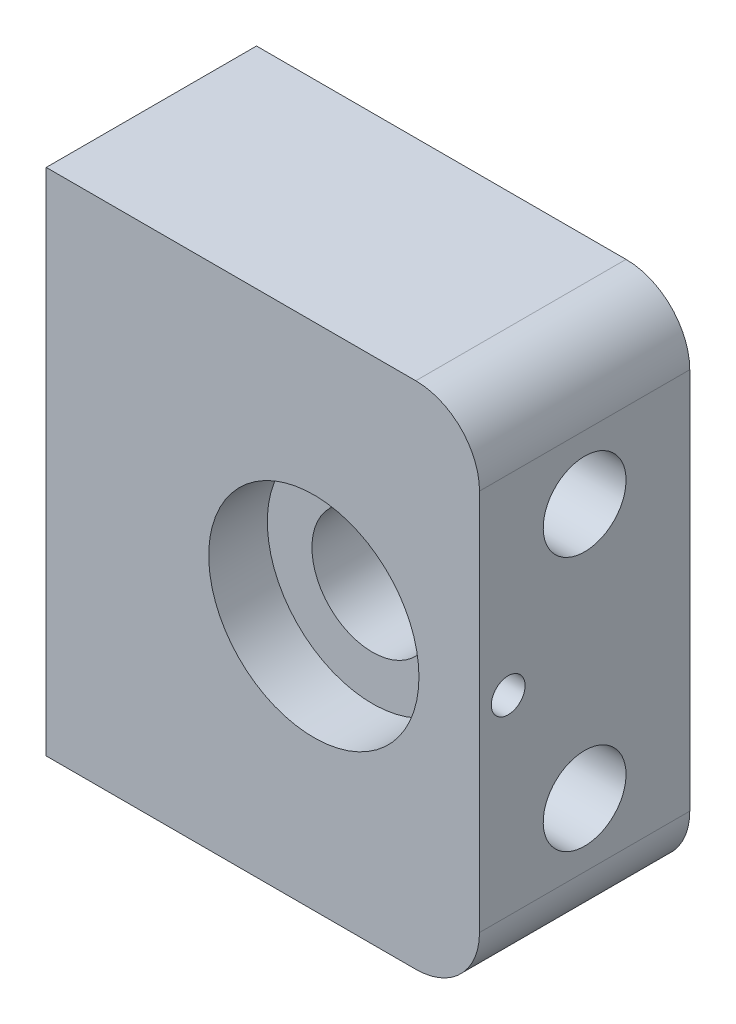
ISO-10303-21;
HEADER;
FILE_DESCRIPTION(('STEP AP214'),'2;1');
FILE_NAME('part.step','',(''),(''),'','','');
FILE_SCHEMA(('AUTOMOTIVE_DESIGN { 1 0 10303 214 1 1 1 1 }'));
ENDSEC;
DATA;
#1=APPLICATION_CONTEXT('core data for automotive mechanical design processes');
#2=APPLICATION_PROTOCOL_DEFINITION('international standard','automotive_design',2000,#1);
#3=PRODUCT_CONTEXT('',#1,'mechanical');
#4=PRODUCT('Part','Part','',(#3));
#5=PRODUCT_RELATED_PRODUCT_CATEGORY('part','',(#4));
#6=PRODUCT_DEFINITION_FORMATION('','',#4);
#7=PRODUCT_DEFINITION_CONTEXT('part definition',#1,'design');
#8=PRODUCT_DEFINITION('design','',#6,#7);
#9=PRODUCT_DEFINITION_SHAPE('','',#8);
#10=(LENGTH_UNIT() NAMED_UNIT(*) SI_UNIT(.MILLI.,.METRE.));
#11=(NAMED_UNIT(*) PLANE_ANGLE_UNIT() SI_UNIT($,.RADIAN.));
#12=(NAMED_UNIT(*) SI_UNIT($,.STERADIAN.) SOLID_ANGLE_UNIT());
#13=UNCERTAINTY_MEASURE_WITH_UNIT(LENGTH_MEASURE(1.E-05),#10,'distance_accuracy_value','');
#14=(GEOMETRIC_REPRESENTATION_CONTEXT(3) GLOBAL_UNCERTAINTY_ASSIGNED_CONTEXT((#13)) GLOBAL_UNIT_ASSIGNED_CONTEXT((#10,
#11,#12)) REPRESENTATION_CONTEXT('',''));
#15=CARTESIAN_POINT('',(0.,0.,0.));
#16=DIRECTION('',(0.,0.,1.));
#17=DIRECTION('',(1.,0.,0.));
#18=AXIS2_PLACEMENT_3D('',#15,#16,#17);
#19=CARTESIAN_POINT('',(-17.001,10.,8.25));
#20=DIRECTION('',(1.,0.,0.));
#21=DIRECTION('',(0.,1.,0.));
#22=AXIS2_PLACEMENT_3D('',#19,#20,#21);
#23=CYLINDRICAL_SURFACE('',#22,1.6);
#24=CARTESIAN_POINT('',(-17.,10.,8.25));
#25=DIRECTION('',(1.,0.,0.));
#26=DIRECTION('',(0.,0.,-1.));
#27=AXIS2_PLACEMENT_3D('',#24,#25,#26);
#28=CIRCLE('',#27,1.6);
#29=CARTESIAN_POINT('',(-17.,10.,6.65));
#30=VERTEX_POINT('',#29);
#31=EDGE_CURVE('E178',#30,#30,#28,.F.);
#32=ORIENTED_EDGE('',*,*,#31,.T.);
#33=EDGE_LOOP('',(#32));
#34=FACE_BOUND('',#33,.T.);
#35=CARTESIAN_POINT('',(-11.6,10.,8.25));
#36=DIRECTION('',(1.,0.,0.));
#37=DIRECTION('',(0.,1.,0.));
#38=AXIS2_PLACEMENT_3D('',#35,#36,#37);
#39=CIRCLE('',#38,1.6);
#40=CARTESIAN_POINT('',(-11.6,11.6,8.25));
#41=VERTEX_POINT('',#40);
#42=EDGE_CURVE('E181',#41,#41,#39,.F.);
#43=ORIENTED_EDGE('',*,*,#42,.F.);
#44=EDGE_LOOP('',(#43));
#45=FACE_BOUND('',#44,.T.);
#46=ADVANCED_FACE('F39',(#34,#45),#23,.F.);
#47=CARTESIAN_POINT('',(-17.001,-10.,8.25));
#48=DIRECTION('',(1.,0.,0.));
#49=DIRECTION('',(0.,1.,0.));
#50=AXIS2_PLACEMENT_3D('',#47,#48,#49);
#51=CYLINDRICAL_SURFACE('',#50,1.6);
#52=CARTESIAN_POINT('',(-17.,-10.,8.25));
#53=DIRECTION('',(1.,0.,0.));
#54=DIRECTION('',(0.,0.,-1.));
#55=AXIS2_PLACEMENT_3D('',#52,#53,#54);
#56=CIRCLE('',#55,1.6);
#57=CARTESIAN_POINT('',(-17.,-10.,6.65));
#58=VERTEX_POINT('',#57);
#59=EDGE_CURVE('E186',#58,#58,#56,.F.);
#60=ORIENTED_EDGE('',*,*,#59,.T.);
#61=EDGE_LOOP('',(#60));
#62=FACE_BOUND('',#61,.T.);
#63=CARTESIAN_POINT('',(-11.6,-10.,8.25));
#64=DIRECTION('',(1.,0.,0.));
#65=DIRECTION('',(0.,1.,0.));
#66=AXIS2_PLACEMENT_3D('',#63,#64,#65);
#67=CIRCLE('',#66,1.6);
#68=CARTESIAN_POINT('',(-11.6,-8.4,8.25));
#69=VERTEX_POINT('',#68);
#70=EDGE_CURVE('E144',#69,#69,#67,.F.);
#71=ORIENTED_EDGE('',*,*,#70,.F.);
#72=EDGE_LOOP('',(#71));
#73=FACE_BOUND('',#72,.T.);
#74=ADVANCED_FACE('F168',(#62,#73),#51,.F.);
#75=CARTESIAN_POINT('',(3.99999999999999,0.,16.5));
#76=DIRECTION('',(0.,0.,-1.));
#77=DIRECTION('',(-1.,0.,0.));
#78=AXIS2_PLACEMENT_3D('',#75,#76,#77);
#79=CYLINDRICAL_SURFACE('',#78,4.75);
#80=CARTESIAN_POINT('',(3.99999999999999,0.,0.));
#81=DIRECTION('',(0.,0.,1.));
#82=DIRECTION('',(1.,0.,0.));
#83=AXIS2_PLACEMENT_3D('',#80,#81,#82);
#84=CIRCLE('',#83,4.75);
#85=CARTESIAN_POINT('',(8.74999999999999,0.,0.));
#86=VERTEX_POINT('',#85);
#87=EDGE_CURVE('E131',#86,#86,#84,.T.);
#88=ORIENTED_EDGE('',*,*,#87,.F.);
#89=EDGE_LOOP('',(#88));
#90=FACE_BOUND('',#89,.T.);
#91=CARTESIAN_POINT('',(3.99999999999999,0.,11.9));
#92=DIRECTION('',(0.,0.,1.));
#93=DIRECTION('',(1.,0.,0.));
#94=AXIS2_PLACEMENT_3D('',#91,#92,#93);
#95=CIRCLE('',#94,4.75);
#96=CARTESIAN_POINT('',(8.74999999999999,0.,11.9));
#97=VERTEX_POINT('',#96);
#98=EDGE_CURVE('E127',#97,#97,#95,.T.);
#99=ORIENTED_EDGE('',*,*,#98,.T.);
#100=EDGE_LOOP('',(#99));
#101=FACE_BOUND('',#100,.T.);
#102=ADVANCED_FACE('F173',(#90,#101),#79,.F.);
#103=CARTESIAN_POINT('',(0.,0.,16.5));
#104=DIRECTION('',(0.,0.,-1.));
#105=DIRECTION('',(-1.,0.,0.));
#106=AXIS2_PLACEMENT_3D('',#103,#104,#105);
#107=PLANE('',#106);
#108=CARTESIAN_POINT('',(3.99999999999999,0.,16.5));
#109=DIRECTION('',(0.,0.,1.));
#110=DIRECTION('',(1.,0.,0.));
#111=AXIS2_PLACEMENT_3D('',#108,#109,#110);
#112=CIRCLE('',#111,8.25);
#113=CARTESIAN_POINT('',(12.25,0.,16.5));
#114=VERTEX_POINT('',#113);
#115=EDGE_CURVE('E142',#114,#114,#112,.T.);
#116=ORIENTED_EDGE('',*,*,#115,.F.);
#117=EDGE_LOOP('',(#116));
#118=FACE_BOUND('',#117,.T.);
#119=DIRECTION('',(1.,0.,0.));
#120=VECTOR('',#119,1.);
#121=CARTESIAN_POINT('',(17.,-20.,16.5));
#122=LINE('',#121,#120);
#123=CARTESIAN_POINT('',(-17.,-20.,16.5));
#124=VERTEX_POINT('',#123);
#125=CARTESIAN_POINT('',(12.,-20.,16.5));
#126=VERTEX_POINT('',#125);
#127=EDGE_CURVE('E93',#124,#126,#122,.T.);
#128=ORIENTED_EDGE('',*,*,#127,.T.);
#129=CARTESIAN_POINT('',(12.,-15.,16.5));
#130=DIRECTION('',(0.,0.,-1.));
#131=DIRECTION('',(-1.,0.,0.));
#132=AXIS2_PLACEMENT_3D('',#129,#130,#131);
#133=CIRCLE('',#132,5.);
#134=CARTESIAN_POINT('',(17.,-15.,16.5));
#135=VERTEX_POINT('',#134);
#136=EDGE_CURVE('E48',#126,#135,#133,.F.);
#137=ORIENTED_EDGE('',*,*,#136,.T.);
#138=DIRECTION('',(0.,1.,0.));
#139=VECTOR('',#138,1.);
#140=CARTESIAN_POINT('',(17.,20.,16.5));
#141=LINE('',#140,#139);
#142=CARTESIAN_POINT('',(17.,15.,16.5));
#143=VERTEX_POINT('',#142);
#144=EDGE_CURVE('E101',#135,#143,#141,.T.);
#145=ORIENTED_EDGE('',*,*,#144,.T.);
#146=CARTESIAN_POINT('',(12.,15.,16.5));
#147=DIRECTION('',(0.,0.,-1.));
#148=DIRECTION('',(-1.,0.,0.));
#149=AXIS2_PLACEMENT_3D('',#146,#147,#148);
#150=CIRCLE('',#149,5.);
#151=CARTESIAN_POINT('',(12.,20.,16.5));
#152=VERTEX_POINT('',#151);
#153=EDGE_CURVE('E55',#143,#152,#150,.F.);
#154=ORIENTED_EDGE('',*,*,#153,.T.);
#155=DIRECTION('',(-1.,0.,0.));
#156=VECTOR('',#155,1.);
#157=CARTESIAN_POINT('',(17.,20.,16.5));
#158=LINE('',#157,#156);
#159=CARTESIAN_POINT('',(-17.,20.,16.5));
#160=VERTEX_POINT('',#159);
#161=EDGE_CURVE('E106',#152,#160,#158,.T.);
#162=ORIENTED_EDGE('',*,*,#161,.T.);
#163=DIRECTION('',(0.,-1.,0.));
#164=VECTOR('',#163,1.);
#165=CARTESIAN_POINT('',(-17.,20.,16.5));
#166=LINE('',#165,#164);
#167=EDGE_CURVE('E102',#160,#124,#166,.T.);
#168=ORIENTED_EDGE('',*,*,#167,.T.);
#169=EDGE_LOOP('',(#128,#137,#145,#154,#162,#168));
#170=FACE_BOUND('',#169,.T.);
#171=ADVANCED_FACE('F105',(#118,#170),#107,.F.);
#172=CARTESIAN_POINT('',(0.,0.,0.));
#173=DIRECTION('',(0.,0.,-1.));
#174=DIRECTION('',(-1.,0.,0.));
#175=AXIS2_PLACEMENT_3D('',#172,#173,#174);
#176=PLANE('',#175);
#177=DIRECTION('',(0.,1.,0.));
#178=VECTOR('',#177,1.);
#179=CARTESIAN_POINT('',(17.,20.,0.));
#180=LINE('',#179,#178);
#181=CARTESIAN_POINT('',(17.,-15.,0.));
#182=VERTEX_POINT('',#181);
#183=CARTESIAN_POINT('',(17.,15.,0.));
#184=VERTEX_POINT('',#183);
#185=EDGE_CURVE('E219',#182,#184,#180,.T.);
#186=ORIENTED_EDGE('',*,*,#185,.F.);
#187=CARTESIAN_POINT('',(12.,-15.,0.));
#188=DIRECTION('',(0.,0.,-1.));
#189=DIRECTION('',(-1.,0.,0.));
#190=AXIS2_PLACEMENT_3D('',#187,#188,#189);
#191=CIRCLE('',#190,5.);
#192=CARTESIAN_POINT('',(12.,-20.,0.));
#193=VERTEX_POINT('',#192);
#194=EDGE_CURVE('E197',#182,#193,#191,.T.);
#195=ORIENTED_EDGE('',*,*,#194,.T.);
#196=DIRECTION('',(1.,0.,0.));
#197=VECTOR('',#196,1.);
#198=CARTESIAN_POINT('',(17.,-20.,0.));
#199=LINE('',#198,#197);
#200=CARTESIAN_POINT('',(-17.,-20.,0.));
#201=VERTEX_POINT('',#200);
#202=EDGE_CURVE('E218',#201,#193,#199,.T.);
#203=ORIENTED_EDGE('',*,*,#202,.F.);
#204=DIRECTION('',(0.,-1.,0.));
#205=VECTOR('',#204,1.);
#206=CARTESIAN_POINT('',(-17.,20.,0.));
#207=LINE('',#206,#205);
#208=CARTESIAN_POINT('',(-17.,20.,0.));
#209=VERTEX_POINT('',#208);
#210=EDGE_CURVE('E115',#209,#201,#207,.T.);
#211=ORIENTED_EDGE('',*,*,#210,.F.);
#212=DIRECTION('',(-1.,0.,0.));
#213=VECTOR('',#212,1.);
#214=CARTESIAN_POINT('',(17.,20.,0.));
#215=LINE('',#214,#213);
#216=CARTESIAN_POINT('',(12.,20.,0.));
#217=VERTEX_POINT('',#216);
#218=EDGE_CURVE('E111',#217,#209,#215,.T.);
#219=ORIENTED_EDGE('',*,*,#218,.F.);
#220=CARTESIAN_POINT('',(12.,15.,0.));
#221=DIRECTION('',(0.,0.,-1.));
#222=DIRECTION('',(-1.,0.,0.));
#223=AXIS2_PLACEMENT_3D('',#220,#221,#222);
#224=CIRCLE('',#223,5.);
#225=EDGE_CURVE('E194',#217,#184,#224,.T.);
#226=ORIENTED_EDGE('',*,*,#225,.T.);
#227=EDGE_LOOP('',(#186,#195,#203,#211,#219,#226));
#228=FACE_BOUND('',#227,.T.);
#229=ORIENTED_EDGE('',*,*,#87,.T.);
#230=EDGE_LOOP('',(#229));
#231=FACE_BOUND('',#230,.T.);
#232=ADVANCED_FACE('F216',(#228,#231),#176,.T.);
#233=CARTESIAN_POINT('',(-17.,20.,16.5));
#234=DIRECTION('',(1.,0.,0.));
#235=DIRECTION('',(0.,0.,-1.));
#236=AXIS2_PLACEMENT_3D('',#233,#234,#235);
#237=PLANE('',#236);
#238=ORIENTED_EDGE('',*,*,#59,.F.);
#239=EDGE_LOOP('',(#238));
#240=FACE_BOUND('',#239,.T.);
#241=ORIENTED_EDGE('',*,*,#31,.F.);
#242=EDGE_LOOP('',(#241));
#243=FACE_BOUND('',#242,.T.);
#244=ORIENTED_EDGE('',*,*,#210,.T.);
#245=DIRECTION('',(0.,0.,-1.));
#246=VECTOR('',#245,1.);
#247=CARTESIAN_POINT('',(-17.,-20.,16.5));
#248=LINE('',#247,#246);
#249=EDGE_CURVE('E97',#124,#201,#248,.T.);
#250=ORIENTED_EDGE('',*,*,#249,.F.);
#251=ORIENTED_EDGE('',*,*,#167,.F.);
#252=DIRECTION('',(0.,0.,-1.));
#253=VECTOR('',#252,1.);
#254=CARTESIAN_POINT('',(-17.,20.,16.5));
#255=LINE('',#254,#253);
#256=EDGE_CURVE('E118',#160,#209,#255,.T.);
#257=ORIENTED_EDGE('',*,*,#256,.T.);
#258=EDGE_LOOP('',(#244,#250,#251,#257));
#259=FACE_BOUND('',#258,.T.);
#260=ADVANCED_FACE('F113',(#240,#243,#259),#237,.F.);
#261=CARTESIAN_POINT('',(17.,-20.,16.5));
#262=DIRECTION('',(0.,1.,0.));
#263=DIRECTION('',(-1.,0.,0.));
#264=AXIS2_PLACEMENT_3D('',#261,#262,#263);
#265=PLANE('',#264);
#266=ORIENTED_EDGE('',*,*,#202,.T.);
#267=DIRECTION('',(0.,0.,-1.));
#268=VECTOR('',#267,1.);
#269=CARTESIAN_POINT('',(12.,-20.,16.5));
#270=LINE('',#269,#268);
#271=EDGE_CURVE('E63',#193,#126,#270,.F.);
#272=ORIENTED_EDGE('',*,*,#271,.T.);
#273=ORIENTED_EDGE('',*,*,#127,.F.);
#274=ORIENTED_EDGE('',*,*,#249,.T.);
#275=EDGE_LOOP('',(#266,#272,#273,#274));
#276=FACE_BOUND('',#275,.T.);
#277=ADVANCED_FACE('F95',(#276),#265,.F.);
#278=CARTESIAN_POINT('',(17.,20.,16.5));
#279=DIRECTION('',(-1.,0.,0.));
#280=DIRECTION('',(0.,-1.,0.));
#281=AXIS2_PLACEMENT_3D('',#278,#279,#280);
#282=PLANE('',#281);
#283=CARTESIAN_POINT('',(17.,-10.,8.25));
#284=DIRECTION('',(1.,0.,0.));
#285=DIRECTION('',(0.,1.,0.));
#286=AXIS2_PLACEMENT_3D('',#283,#284,#285);
#287=CIRCLE('',#286,3.25);
#288=CARTESIAN_POINT('',(17.,-6.75,8.25));
#289=VERTEX_POINT('',#288);
#290=EDGE_CURVE('E289',#289,#289,#287,.T.);
#291=ORIENTED_EDGE('',*,*,#290,.F.);
#292=EDGE_LOOP('',(#291));
#293=FACE_BOUND('',#292,.T.);
#294=CARTESIAN_POINT('',(17.,10.,8.25));
#295=DIRECTION('',(1.,0.,0.));
#296=DIRECTION('',(0.,1.,0.));
#297=AXIS2_PLACEMENT_3D('',#294,#295,#296);
#298=CIRCLE('',#297,3.25);
#299=CARTESIAN_POINT('',(17.,13.25,8.25));
#300=VERTEX_POINT('',#299);
#301=EDGE_CURVE('E281',#300,#300,#298,.T.);
#302=ORIENTED_EDGE('',*,*,#301,.F.);
#303=EDGE_LOOP('',(#302));
#304=FACE_BOUND('',#303,.T.);
#305=CARTESIAN_POINT('',(17.,0.,14.25));
#306=DIRECTION('',(1.,0.,0.));
#307=DIRECTION('',(0.,1.,0.));
#308=AXIS2_PLACEMENT_3D('',#305,#306,#307);
#309=CIRCLE('',#308,1.325);
#310=CARTESIAN_POINT('',(17.,1.325,14.25));
#311=VERTEX_POINT('',#310);
#312=EDGE_CURVE('E143',#311,#311,#309,.T.);
#313=ORIENTED_EDGE('',*,*,#312,.F.);
#314=EDGE_LOOP('',(#313));
#315=FACE_BOUND('',#314,.T.);
#316=ORIENTED_EDGE('',*,*,#144,.F.);
#317=DIRECTION('',(0.,0.,-1.));
#318=VECTOR('',#317,1.);
#319=CARTESIAN_POINT('',(17.,-15.,16.5));
#320=LINE('',#319,#318);
#321=EDGE_CURVE('E122',#135,#182,#320,.T.);
#322=ORIENTED_EDGE('',*,*,#321,.T.);
#323=ORIENTED_EDGE('',*,*,#185,.T.);
#324=DIRECTION('',(0.,0.,-1.));
#325=VECTOR('',#324,1.);
#326=CARTESIAN_POINT('',(17.,15.,16.5));
#327=LINE('',#326,#325);
#328=EDGE_CURVE('E117',#184,#143,#327,.F.);
#329=ORIENTED_EDGE('',*,*,#328,.T.);
#330=EDGE_LOOP('',(#316,#322,#323,#329));
#331=FACE_BOUND('',#330,.T.);
#332=ADVANCED_FACE('F208',(#293,#304,#315,#331),#282,.F.);
#333=CARTESIAN_POINT('',(17.,20.,16.5));
#334=DIRECTION('',(0.,-1.,0.));
#335=DIRECTION('',(1.,0.,0.));
#336=AXIS2_PLACEMENT_3D('',#333,#334,#335);
#337=PLANE('',#336);
#338=ORIENTED_EDGE('',*,*,#161,.F.);
#339=DIRECTION('',(0.,0.,-1.));
#340=VECTOR('',#339,1.);
#341=CARTESIAN_POINT('',(12.,20.,16.5));
#342=LINE('',#341,#340);
#343=EDGE_CURVE('E11',#152,#217,#342,.T.);
#344=ORIENTED_EDGE('',*,*,#343,.T.);
#345=ORIENTED_EDGE('',*,*,#218,.T.);
#346=ORIENTED_EDGE('',*,*,#256,.F.);
#347=EDGE_LOOP('',(#338,#344,#345,#346));
#348=FACE_BOUND('',#347,.T.);
#349=ADVANCED_FACE('F163',(#348),#337,.F.);
#350=CARTESIAN_POINT('',(3.99999999999999,0.,11.9));
#351=DIRECTION('',(0.,0.,1.));
#352=DIRECTION('',(1.,0.,0.));
#353=AXIS2_PLACEMENT_3D('',#350,#351,#352);
#354=CYLINDRICAL_SURFACE('',#353,8.25);
#355=CARTESIAN_POINT('',(12.25,0.,12.925));
#356=CARTESIAN_POINT('',(12.2499987610783,0.0739159724591063,12.9250029969044));
#357=CARTESIAN_POINT('',(12.2489962523206,0.147873244243583,12.9312060640969));
#358=CARTESIAN_POINT('',(12.2450935625293,0.293716164422064,12.9558456377468));
#359=CARTESIAN_POINT('',(12.2421915979208,0.365599799384814,12.9742936423391));
#360=CARTESIAN_POINT('',(12.2348157238169,0.505164072246961,13.02285392779));
#361=CARTESIAN_POINT('',(12.2303430639034,0.572848001043194,13.0529569383422));
#362=CARTESIAN_POINT('',(12.2203184977307,0.702194815191877,13.1239490436477));
#363=CARTESIAN_POINT('',(12.2147667248106,0.763858443021463,13.1648368060212));
#364=CARTESIAN_POINT('',(12.2031448246484,0.879972647470743,13.2566253219791));
#365=CARTESIAN_POINT('',(12.197070919643,0.934361835674824,13.3076032629934));
#366=CARTESIAN_POINT('',(12.1851184808107,1.03385320659847,13.417958925355));
#367=CARTESIAN_POINT('',(12.1792399589127,1.078954823143,13.4773371584164));
#368=CARTESIAN_POINT('',(12.1683072718076,1.1588341884463,13.6032261537294));
#369=CARTESIAN_POINT('',(12.1632579887788,1.19355171879873,13.6697755868021));
#370=CARTESIAN_POINT('',(12.154607593091,1.25129241921246,13.8078560153364));
#371=CARTESIAN_POINT('',(12.1510063897599,1.27431632149851,13.8793866985659));
#372=CARTESIAN_POINT('',(12.1456973360387,1.30782380717939,14.0247502568937));
#373=CARTESIAN_POINT('',(12.1439735420508,1.31841305111189,14.0985581832069));
#374=CARTESIAN_POINT('',(12.1425661896034,1.32707812897749,14.2469218628656));
#375=CARTESIAN_POINT('',(12.1428824970266,1.32515478549448,14.3214775667301));
#376=CARTESIAN_POINT('',(12.1455050430844,1.3089354551364,14.4684691413566));
#377=CARTESIAN_POINT('',(12.1477922526078,1.29475778016222,14.54091845561));
#378=CARTESIAN_POINT('',(12.1540691284538,1.25461773582885,14.6823964678503));
#379=CARTESIAN_POINT('',(12.1580588493473,1.22865498871937,14.7514250561131));
#380=CARTESIAN_POINT('',(12.1673119374755,1.16556067547053,14.8844585050845));
#381=CARTESIAN_POINT('',(12.1725809286268,1.12837961127627,14.9484394829213));
#382=CARTESIAN_POINT('',(12.1837949118042,1.04393928091598,15.0692991740133));
#383=CARTESIAN_POINT('',(12.1897399545581,0.99667925823624,15.1261773536331));
#384=CARTESIAN_POINT('',(12.2017199737181,0.892776120995943,15.2319020514858));
#385=CARTESIAN_POINT('',(12.207755198498,0.83603141647516,15.2806487571604));
#386=CARTESIAN_POINT('',(12.2191723007278,0.715114268854854,15.3679431219276));
#387=CARTESIAN_POINT('',(12.2245541745064,0.650941784022119,15.4064907237122));
#388=CARTESIAN_POINT('',(12.2340650412767,0.516899602553848,15.4723002502912));
#389=CARTESIAN_POINT('',(12.2381931013572,0.4470257125377,15.4995537770952));
#390=CARTESIAN_POINT('',(12.2447236224851,0.30361153438943,15.5419111004277));
#391=CARTESIAN_POINT('',(12.2471262174608,0.23007153129032,15.5570158399407));
#392=CARTESIAN_POINT('',(12.2499171941907,0.0822733830856734,15.5745124833691));
#393=CARTESIAN_POINT('',(12.2503272963098,0.00803186328586335,15.5770414838481));
#394=CARTESIAN_POINT('',(12.2491464331577,-0.139814451787394,15.5696797612761));
#395=CARTESIAN_POINT('',(12.2475555392062,-0.213419269660081,15.5597894808742));
#396=CARTESIAN_POINT('',(12.2425648782025,-0.357482420992891,15.5279839679675));
#397=CARTESIAN_POINT('',(12.2391752634219,-0.427956031787067,15.506136203929));
#398=CARTESIAN_POINT('',(12.2309658042547,-0.564240124387105,15.4511075340329));
#399=CARTESIAN_POINT('',(12.2261458843823,-0.630050359851745,15.4179260300124));
#400=CARTESIAN_POINT('',(12.2155569282177,-0.755737854961636,15.3408549226671));
#401=CARTESIAN_POINT('',(12.2097803851632,-0.815561651155121,15.2968791821029));
#402=CARTESIAN_POINT('',(12.1979427039999,-0.927029245275312,15.1995869377626));
#403=CARTESIAN_POINT('',(12.1918815468018,-0.978672493509218,15.1462698067973));
#404=CARTESIAN_POINT('',(12.1800880418408,-1.07281772325956,15.0311950606016));
#405=CARTESIAN_POINT('',(12.1743594024325,-1.11522734424895,14.9693614439588));
#406=CARTESIAN_POINT('',(12.1639474568824,-1.1890575722117,14.8393673376478));
#407=CARTESIAN_POINT('',(12.1592641193696,-1.22047850898682,14.7712070379389));
#408=CARTESIAN_POINT('',(12.1515005081894,-1.27129941817153,14.6307590656544));
#409=CARTESIAN_POINT('',(12.1484139800556,-1.29074634883588,14.5584887460757));
#410=CARTESIAN_POINT('',(12.1441774106874,-1.31721565005725,14.4116540114841));
#411=CARTESIAN_POINT('',(12.143027214229,-1.32423901653918,14.3370897808484));
#412=CARTESIAN_POINT('',(12.1427998964296,-1.32563557247238,14.1887054491309));
#413=CARTESIAN_POINT('',(12.1436989610256,-1.3201540778382,14.1148867116439));
#414=CARTESIAN_POINT('',(12.1474168357389,-1.29700967464369,13.9692360315878));
#415=CARTESIAN_POINT('',(12.1502356408773,-1.27934679767621,13.8974040838664));
#416=CARTESIAN_POINT('',(12.1574666088976,-1.23239509634864,13.7578162632162));
#417=CARTESIAN_POINT('',(12.1618771772453,-1.20311790362195,13.6900563900834));
#418=CARTESIAN_POINT('',(12.1717963965393,-1.13378337624906,13.5603867251755));
#419=CARTESIAN_POINT('',(12.1773050955235,-1.09372556997622,13.4984771894989));
#420=CARTESIAN_POINT('',(12.1888757887347,-1.00344475824469,13.3815298257873));
#421=CARTESIAN_POINT('',(12.1949432127654,-0.953114565359019,13.3265752703006));
#422=CARTESIAN_POINT('',(12.2069036489714,-0.843944009440461,13.2258414891674));
#423=CARTESIAN_POINT('',(12.2127966204781,-0.785101680580093,13.1800643888425));
#424=CARTESIAN_POINT('',(12.2237874602855,-0.660133203713974,13.0987205448069));
#425=CARTESIAN_POINT('',(12.2288800252028,-0.593963049493113,13.0632206918319));
#426=CARTESIAN_POINT('',(12.2376445496354,-0.456545620853425,13.0038938708822));
#427=CARTESIAN_POINT('',(12.2413179444964,-0.385303562995204,12.98005510238));
#428=CARTESIAN_POINT('',(12.2460147039733,-0.261473502967783,12.9499895790305));
#429=CARTESIAN_POINT('',(12.2475013199985,-0.209640561826469,12.9406332348358));
#430=CARTESIAN_POINT('',(12.2494944014635,-0.105212048377527,12.9281374262713));
#431=CARTESIAN_POINT('',(12.2500008819164,-0.0526164877635177,12.9249978666778));
#432=CARTESIAN_POINT('',(12.25,0.,12.925));
#433=B_SPLINE_CURVE_WITH_KNOTS('',3,(#355,#356,#357,#358,#359,#360,#361,#362,#363,#364,#365,
#366,#367,#368,#369,#370,#371,#372,#373,#374,#375,#376,#377,#378,#379,#380,#381,#382,#383,#384,
#385,#386,#387,#388,#389,#390,#391,#392,#393,#394,#395,#396,#397,#398,#399,#400,#401,#402,#403,
#404,#405,#406,#407,#408,#409,#410,#411,#412,#413,#414,#415,#416,#417,#418,#419,#420,#421,#422,
#423,#424,#425,#426,#427,#428,#429,#430,#431,#432),.UNSPECIFIED.,.T.,.F.,(4,2,2,2,2,2,2,2,2,2,2,
2,2,2,2,2,2,2,2,2,2,2,2,2,2,2,2,2,2,2,2,2,2,2,2,2,2,2,4),(0.,0.221555612498965,
0.443319563102308,0.664907485455867,0.886468045000209,1.10979399529895,1.3331335556321,
1.55774423511057,1.7823408483146,2.00501486916619,2.22767425146177,2.44820763601417,
2.6687480898855,2.89027621870669,3.11182098100126,3.33591176009697,3.56000379831477,
3.7842621680488,4.00850312924971,4.23029404661164,4.45207705910673,4.67262140234645,
4.89317738709483,5.11555412736181,5.33794580392493,5.56246903677905,5.78698553047202,
6.01061583831862,6.23422821821087,6.45525530904958,6.67628182664853,6.89708754473824,
7.11790292413255,7.34115243998295,7.56445359654448,7.78917704226296,8.01367260439978,
8.17138759278605,8.32910016540285),.UNSPECIFIED.);
#434=CARTESIAN_POINT('',(12.25,0.,12.925));
#435=VERTEX_POINT('',#434);
#436=EDGE_CURVE('E133',#435,#435,#433,.T.);
#437=ORIENTED_EDGE('',*,*,#436,.T.);
#438=EDGE_LOOP('',(#437));
#439=FACE_BOUND('',#438,.T.);
#440=CARTESIAN_POINT('',(3.99999999999999,0.,11.9));
#441=DIRECTION('',(0.,0.,1.));
#442=DIRECTION('',(1.,0.,0.));
#443=AXIS2_PLACEMENT_3D('',#440,#441,#442);
#444=CIRCLE('',#443,8.25);
#445=CARTESIAN_POINT('',(12.25,0.,11.9));
#446=VERTEX_POINT('',#445);
#447=EDGE_CURVE('E132',#446,#446,#444,.T.);
#448=ORIENTED_EDGE('',*,*,#447,.F.);
#449=EDGE_LOOP('',(#448));
#450=FACE_BOUND('',#449,.T.);
#451=ORIENTED_EDGE('',*,*,#115,.T.);
#452=EDGE_LOOP('',(#451));
#453=FACE_BOUND('',#452,.T.);
#454=ADVANCED_FACE('F146',(#439,#450,#453),#354,.F.);
#455=CARTESIAN_POINT('',(3.99999999999999,0.,11.9));
#456=DIRECTION('',(0.,0.,1.));
#457=DIRECTION('',(1.,0.,0.));
#458=AXIS2_PLACEMENT_3D('',#455,#456,#457);
#459=PLANE('',#458);
#460=ORIENTED_EDGE('',*,*,#98,.F.);
#461=EDGE_LOOP('',(#460));
#462=FACE_BOUND('',#461,.T.);
#463=ORIENTED_EDGE('',*,*,#447,.T.);
#464=EDGE_LOOP('',(#463));
#465=FACE_BOUND('',#464,.T.);
#466=ADVANCED_FACE('F155',(#462,#465),#459,.T.);
#467=CARTESIAN_POINT('',(11.4,0.,14.25));
#468=DIRECTION('',(1.,0.,0.));
#469=DIRECTION('',(0.,1.,0.));
#470=AXIS2_PLACEMENT_3D('',#467,#468,#469);
#471=CYLINDRICAL_SURFACE('',#470,1.325);
#472=ORIENTED_EDGE('',*,*,#312,.T.);
#473=EDGE_LOOP('',(#472));
#474=FACE_BOUND('',#473,.T.);
#475=ORIENTED_EDGE('',*,*,#436,.F.);
#476=EDGE_LOOP('',(#475));
#477=FACE_BOUND('',#476,.T.);
#478=ADVANCED_FACE('F150',(#474,#477),#471,.F.);
#479=CARTESIAN_POINT('',(-11.6,-10.,8.25));
#480=DIRECTION('',(1.,0.,0.));
#481=DIRECTION('',(0.,1.,0.));
#482=AXIS2_PLACEMENT_3D('',#479,#480,#481);
#483=PLANE('',#482);
#484=CARTESIAN_POINT('',(-11.6,-10.,8.25));
#485=DIRECTION('',(1.,0.,0.));
#486=DIRECTION('',(0.,1.,0.));
#487=AXIS2_PLACEMENT_3D('',#484,#485,#486);
#488=CIRCLE('',#487,3.25);
#489=CARTESIAN_POINT('',(-11.6,-6.75,8.25));
#490=VERTEX_POINT('',#489);
#491=EDGE_CURVE('E189',#490,#490,#488,.T.);
#492=ORIENTED_EDGE('',*,*,#491,.T.);
#493=EDGE_LOOP('',(#492));
#494=FACE_BOUND('',#493,.T.);
#495=ORIENTED_EDGE('',*,*,#70,.T.);
#496=EDGE_LOOP('',(#495));
#497=FACE_BOUND('',#496,.T.);
#498=ADVANCED_FACE('F154',(#494,#497),#483,.T.);
#499=CARTESIAN_POINT('',(-11.6,-10.,8.25));
#500=DIRECTION('',(1.,0.,0.));
#501=DIRECTION('',(0.,1.,0.));
#502=AXIS2_PLACEMENT_3D('',#499,#500,#501);
#503=CYLINDRICAL_SURFACE('',#502,3.25);
#504=ORIENTED_EDGE('',*,*,#491,.F.);
#505=EDGE_LOOP('',(#504));
#506=FACE_BOUND('',#505,.T.);
#507=ORIENTED_EDGE('',*,*,#290,.T.);
#508=EDGE_LOOP('',(#507));
#509=FACE_BOUND('',#508,.T.);
#510=ADVANCED_FACE('F299',(#506,#509),#503,.F.);
#511=CARTESIAN_POINT('',(-11.6,10.,8.25));
#512=DIRECTION('',(1.,0.,0.));
#513=DIRECTION('',(0.,1.,0.));
#514=AXIS2_PLACEMENT_3D('',#511,#512,#513);
#515=PLANE('',#514);
#516=CARTESIAN_POINT('',(-11.6,10.,8.25));
#517=DIRECTION('',(1.,0.,0.));
#518=DIRECTION('',(0.,1.,0.));
#519=AXIS2_PLACEMENT_3D('',#516,#517,#518);
#520=CIRCLE('',#519,3.25);
#521=CARTESIAN_POINT('',(-11.6,13.25,8.25));
#522=VERTEX_POINT('',#521);
#523=EDGE_CURVE('E285',#522,#522,#520,.T.);
#524=ORIENTED_EDGE('',*,*,#523,.T.);
#525=EDGE_LOOP('',(#524));
#526=FACE_BOUND('',#525,.T.);
#527=ORIENTED_EDGE('',*,*,#42,.T.);
#528=EDGE_LOOP('',(#527));
#529=FACE_BOUND('',#528,.T.);
#530=ADVANCED_FACE('F240',(#526,#529),#515,.T.);
#531=CARTESIAN_POINT('',(-11.6,10.,8.25));
#532=DIRECTION('',(1.,0.,0.));
#533=DIRECTION('',(0.,1.,0.));
#534=AXIS2_PLACEMENT_3D('',#531,#532,#533);
#535=CYLINDRICAL_SURFACE('',#534,3.25);
#536=ORIENTED_EDGE('',*,*,#523,.F.);
#537=EDGE_LOOP('',(#536));
#538=FACE_BOUND('',#537,.T.);
#539=ORIENTED_EDGE('',*,*,#301,.T.);
#540=EDGE_LOOP('',(#539));
#541=FACE_BOUND('',#540,.T.);
#542=ADVANCED_FACE('F236',(#538,#541),#535,.F.);
#543=CARTESIAN_POINT('',(12.,-15.,16.5));
#544=DIRECTION('',(0.,0.,-1.));
#545=DIRECTION('',(-1.,0.,0.));
#546=AXIS2_PLACEMENT_3D('',#543,#544,#545);
#547=CYLINDRICAL_SURFACE('',#546,5.);
#548=ORIENTED_EDGE('',*,*,#136,.F.);
#549=ORIENTED_EDGE('',*,*,#271,.F.);
#550=ORIENTED_EDGE('',*,*,#194,.F.);
#551=ORIENTED_EDGE('',*,*,#321,.F.);
#552=EDGE_LOOP('',(#548,#549,#550,#551));
#553=FACE_BOUND('',#552,.T.);
#554=ADVANCED_FACE('F214',(#553),#547,.T.);
#555=CARTESIAN_POINT('',(12.,15.,16.5));
#556=DIRECTION('',(0.,0.,-1.));
#557=DIRECTION('',(-1.,0.,0.));
#558=AXIS2_PLACEMENT_3D('',#555,#556,#557);
#559=CYLINDRICAL_SURFACE('',#558,5.);
#560=ORIENTED_EDGE('',*,*,#153,.F.);
#561=ORIENTED_EDGE('',*,*,#328,.F.);
#562=ORIENTED_EDGE('',*,*,#225,.F.);
#563=ORIENTED_EDGE('',*,*,#343,.F.);
#564=EDGE_LOOP('',(#560,#561,#562,#563));
#565=FACE_BOUND('',#564,.T.);
#566=ADVANCED_FACE('F41',(#565),#559,.T.);
#567=CLOSED_SHELL('',(#46,#74,#102,#171,#232,#260,#277,#332,#349,#454,#466,#478,#498,#510,#530,
#542,#554,#566));
#568=MANIFOLD_SOLID_BREP('B2',#567);
#569=ADVANCED_BREP_SHAPE_REPRESENTATION('',(#18,#568),#14);
#570=SHAPE_DEFINITION_REPRESENTATION(#9,#569);
ENDSEC;
END-ISO-10303-21;
